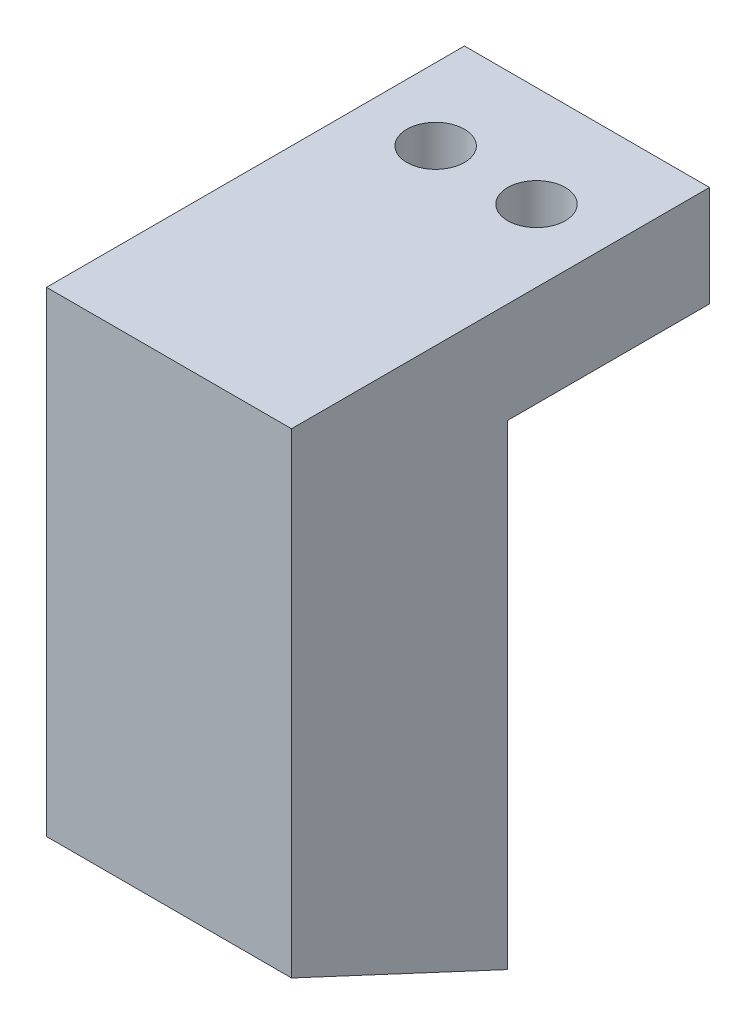
ISO-10303-21;
HEADER;
FILE_DESCRIPTION(('STEP AP214'),'2;1');
FILE_NAME('part.step','',(''),(''),'','','');
FILE_SCHEMA(('AUTOMOTIVE_DESIGN { 1 0 10303 214 1 1 1 1 }'));
ENDSEC;
DATA;
#1=APPLICATION_CONTEXT('core data for automotive mechanical design processes');
#2=APPLICATION_PROTOCOL_DEFINITION('international standard','automotive_design',2000,#1);
#3=PRODUCT_CONTEXT('',#1,'mechanical');
#4=PRODUCT('Part','Part','',(#3));
#5=PRODUCT_RELATED_PRODUCT_CATEGORY('part','',(#4));
#6=PRODUCT_DEFINITION_FORMATION('','',#4);
#7=PRODUCT_DEFINITION_CONTEXT('part definition',#1,'design');
#8=PRODUCT_DEFINITION('design','',#6,#7);
#9=PRODUCT_DEFINITION_SHAPE('','',#8);
#10=(LENGTH_UNIT() NAMED_UNIT(*) SI_UNIT(.MILLI.,.METRE.));
#11=(NAMED_UNIT(*) PLANE_ANGLE_UNIT() SI_UNIT($,.RADIAN.));
#12=(NAMED_UNIT(*) SI_UNIT($,.STERADIAN.) SOLID_ANGLE_UNIT());
#13=UNCERTAINTY_MEASURE_WITH_UNIT(LENGTH_MEASURE(1.E-05),#10,'distance_accuracy_value','');
#14=(GEOMETRIC_REPRESENTATION_CONTEXT(3) GLOBAL_UNCERTAINTY_ASSIGNED_CONTEXT((#13)) GLOBAL_UNIT_ASSIGNED_CONTEXT((#10,
#11,#12)) REPRESENTATION_CONTEXT('',''));
#15=CARTESIAN_POINT('',(0.,0.,0.));
#16=DIRECTION('',(0.,0.,1.));
#17=DIRECTION('',(1.,0.,0.));
#18=AXIS2_PLACEMENT_3D('',#15,#16,#17);
#19=CARTESIAN_POINT('',(-76.9047619047619,40.,-16.0714285714286));
#20=DIRECTION('',(0.,0.,1.));
#21=DIRECTION('',(1.,0.,0.));
#22=AXIS2_PLACEMENT_3D('',#19,#20,#21);
#23=PLANE('',#22);
#24=CARTESIAN_POINT('',(-68.3693266649987,21.4157068063248,-16.0714285714286));
#25=DIRECTION('',(0.,0.,1.));
#26=DIRECTION('',(0.,-1.,0.));
#27=AXIS2_PLACEMENT_3D('',#24,#25,#26);
#28=ELLIPSE('',#27,3.54930237472879,1.5);
#29=CARTESIAN_POINT('',(-68.3693266649987,17.866404431596,-16.0714285714286));
#30=VERTEX_POINT('',#29);
#31=EDGE_CURVE('E130',#30,#30,#28,.T.);
#32=ORIENTED_EDGE('',*,*,#31,.T.);
#33=EDGE_LOOP('',(#32));
#34=FACE_BOUND('',#33,.T.);
#35=DIRECTION('',(-1.,0.,0.));
#36=VECTOR('',#35,1.);
#37=CARTESIAN_POINT('',(-76.9047619047619,33.,-16.0714285714286));
#38=LINE('',#37,#36);
#39=CARTESIAN_POINT('',(-59.9047619047619,33.,-16.0714285714286));
#40=VERTEX_POINT('',#39);
#41=CARTESIAN_POINT('',(-76.9047619047619,33.,-16.0714285714286));
#42=VERTEX_POINT('',#41);
#43=EDGE_CURVE('E50',#40,#42,#38,.T.);
#44=ORIENTED_EDGE('',*,*,#43,.F.);
#45=DIRECTION('',(0.,-1.,0.));
#46=VECTOR('',#45,1.);
#47=CARTESIAN_POINT('',(-59.9047619047619,40.,-16.0714285714286));
#48=LINE('',#47,#46);
#49=CARTESIAN_POINT('',(-59.9047619047619,0.,-16.0714285714286));
#50=VERTEX_POINT('',#49);
#51=EDGE_CURVE('E143',#40,#50,#48,.T.);
#52=ORIENTED_EDGE('',*,*,#51,.T.);
#53=DIRECTION('',(-1.,0.,0.));
#54=VECTOR('',#53,1.);
#55=CARTESIAN_POINT('',(-76.9047619047619,0.,-16.0714285714286));
#56=LINE('',#55,#54);
#57=CARTESIAN_POINT('',(-76.9047619047619,0.,-16.0714285714286));
#58=VERTEX_POINT('',#57);
#59=EDGE_CURVE('E99',#50,#58,#56,.T.);
#60=ORIENTED_EDGE('',*,*,#59,.T.);
#61=DIRECTION('',(0.,-1.,0.));
#62=VECTOR('',#61,1.);
#63=CARTESIAN_POINT('',(-76.9047619047619,40.,-16.0714285714286));
#64=LINE('',#63,#62);
#65=EDGE_CURVE('E69',#42,#58,#64,.T.);
#66=ORIENTED_EDGE('',*,*,#65,.F.);
#67=EDGE_LOOP('',(#44,#52,#60,#66));
#68=FACE_BOUND('',#67,.T.);
#69=ADVANCED_FACE('F35',(#34,#68),#23,.F.);
#70=CARTESIAN_POINT('',(-76.9047619047619,40.,-16.0714285714286));
#71=DIRECTION('',(1.,0.,0.));
#72=DIRECTION('',(0.,0.,-1.));
#73=AXIS2_PLACEMENT_3D('',#70,#71,#72);
#74=PLANE('',#73);
#75=DIRECTION('',(0.,0.,1.));
#76=VECTOR('',#75,1.);
#77=CARTESIAN_POINT('',(-76.9047619047619,40.,-16.0714285714286));
#78=LINE('',#77,#76);
#79=CARTESIAN_POINT('',(-76.9047619047619,40.,-30.0714285714286));
#80=VERTEX_POINT('',#79);
#81=CARTESIAN_POINT('',(-76.9047619047619,40.,-1.07142857142857));
#82=VERTEX_POINT('',#81);
#83=EDGE_CURVE('E95',#80,#82,#78,.T.);
#84=ORIENTED_EDGE('',*,*,#83,.F.);
#85=DIRECTION('',(0.,1.,0.));
#86=VECTOR('',#85,1.);
#87=CARTESIAN_POINT('',(-76.9047619047619,40.,-30.0714285714286));
#88=LINE('',#87,#86);
#89=CARTESIAN_POINT('',(-76.9047619047619,33.,-30.0714285714286));
#90=VERTEX_POINT('',#89);
#91=EDGE_CURVE('E98',#90,#80,#88,.T.);
#92=ORIENTED_EDGE('',*,*,#91,.F.);
#93=DIRECTION('',(0.,0.,1.));
#94=VECTOR('',#93,1.);
#95=CARTESIAN_POINT('',(-76.9047619047619,33.,-30.0714285714286));
#96=LINE('',#95,#94);
#97=EDGE_CURVE('E121',#90,#42,#96,.T.);
#98=ORIENTED_EDGE('',*,*,#97,.T.);
#99=ORIENTED_EDGE('',*,*,#65,.T.);
#100=DIRECTION('',(0.,0.422618261740694,0.906307787036653));
#101=VECTOR('',#100,1.);
#102=CARTESIAN_POINT('',(-76.9047619047619,7.14424780626902,-0.750539709049178));
#103=LINE('',#102,#101);
#104=CARTESIAN_POINT('',(-76.9047619047619,6.99461487232486,-1.07142857142857));
#105=VERTEX_POINT('',#104);
#106=EDGE_CURVE('E136',#58,#105,#103,.T.);
#107=ORIENTED_EDGE('',*,*,#106,.T.);
#108=DIRECTION('',(0.,-1.,0.));
#109=VECTOR('',#108,1.);
#110=CARTESIAN_POINT('',(-76.9047619047619,40.,-1.07142857142857));
#111=LINE('',#110,#109);
#112=EDGE_CURVE('E11',#82,#105,#111,.T.);
#113=ORIENTED_EDGE('',*,*,#112,.F.);
#114=EDGE_LOOP('',(#84,#92,#98,#99,#107,#113));
#115=FACE_BOUND('',#114,.T.);
#116=ADVANCED_FACE('F37',(#115),#74,.F.);
#117=CARTESIAN_POINT('',(-76.9047619047619,40.,-1.07142857142857));
#118=DIRECTION('',(0.,0.,-1.));
#119=DIRECTION('',(-1.,0.,0.));
#120=AXIS2_PLACEMENT_3D('',#117,#118,#119);
#121=PLANE('',#120);
#122=ORIENTED_EDGE('',*,*,#112,.T.);
#123=DIRECTION('',(1.,0.,0.));
#124=VECTOR('',#123,1.);
#125=CARTESIAN_POINT('',(-99.9047619047619,6.99461487232486,-1.07142857142857));
#126=LINE('',#125,#124);
#127=CARTESIAN_POINT('',(-59.9047619047619,6.99461487232486,-1.07142857142857));
#128=VERTEX_POINT('',#127);
#129=EDGE_CURVE('E76',#105,#128,#126,.T.);
#130=ORIENTED_EDGE('',*,*,#129,.T.);
#131=DIRECTION('',(0.,-1.,0.));
#132=VECTOR('',#131,1.);
#133=CARTESIAN_POINT('',(-59.9047619047619,40.,-1.07142857142857));
#134=LINE('',#133,#132);
#135=CARTESIAN_POINT('',(-59.9047619047619,40.,-1.07142857142857));
#136=VERTEX_POINT('',#135);
#137=EDGE_CURVE('E43',#136,#128,#134,.T.);
#138=ORIENTED_EDGE('',*,*,#137,.F.);
#139=DIRECTION('',(1.,0.,0.));
#140=VECTOR('',#139,1.);
#141=CARTESIAN_POINT('',(-76.9047619047619,40.,-1.07142857142857));
#142=LINE('',#141,#140);
#143=EDGE_CURVE('E59',#82,#136,#142,.T.);
#144=ORIENTED_EDGE('',*,*,#143,.F.);
#145=EDGE_LOOP('',(#122,#130,#138,#144));
#146=FACE_BOUND('',#145,.T.);
#147=ADVANCED_FACE('F149',(#146),#121,.F.);
#148=CARTESIAN_POINT('',(-59.9047619047619,40.,-16.0714285714286));
#149=DIRECTION('',(-1.,0.,0.));
#150=DIRECTION('',(0.,0.,1.));
#151=AXIS2_PLACEMENT_3D('',#148,#149,#150);
#152=PLANE('',#151);
#153=ORIENTED_EDGE('',*,*,#137,.T.);
#154=DIRECTION('',(0.,0.422618261740694,0.906307787036653));
#155=VECTOR('',#154,1.);
#156=CARTESIAN_POINT('',(-59.9047619047619,6.99461487232486,-1.07142857142857));
#157=LINE('',#156,#155);
#158=EDGE_CURVE('E133',#50,#128,#157,.T.);
#159=ORIENTED_EDGE('',*,*,#158,.F.);
#160=ORIENTED_EDGE('',*,*,#51,.F.);
#161=DIRECTION('',(0.,0.,1.));
#162=VECTOR('',#161,1.);
#163=CARTESIAN_POINT('',(-59.9047619047619,33.,-30.0714285714286));
#164=LINE('',#163,#162);
#165=CARTESIAN_POINT('',(-59.9047619047619,33.,-30.0714285714286));
#166=VERTEX_POINT('',#165);
#167=EDGE_CURVE('E124',#166,#40,#164,.T.);
#168=ORIENTED_EDGE('',*,*,#167,.F.);
#169=DIRECTION('',(0.,-1.,0.));
#170=VECTOR('',#169,1.);
#171=CARTESIAN_POINT('',(-59.9047619047619,40.,-30.0714285714286));
#172=LINE('',#171,#170);
#173=CARTESIAN_POINT('',(-59.9047619047619,40.,-30.0714285714286));
#174=VERTEX_POINT('',#173);
#175=EDGE_CURVE('E108',#174,#166,#172,.T.);
#176=ORIENTED_EDGE('',*,*,#175,.F.);
#177=DIRECTION('',(0.,0.,-1.));
#178=VECTOR('',#177,1.);
#179=CARTESIAN_POINT('',(-59.9047619047619,40.,-16.0714285714286));
#180=LINE('',#179,#178);
#181=EDGE_CURVE('E105',#136,#174,#180,.T.);
#182=ORIENTED_EDGE('',*,*,#181,.F.);
#183=EDGE_LOOP('',(#153,#159,#160,#168,#176,#182));
#184=FACE_BOUND('',#183,.T.);
#185=ADVANCED_FACE('F147',(#184),#152,.F.);
#186=CARTESIAN_POINT('',(0.,40.,0.));
#187=DIRECTION('',(0.,1.,0.));
#188=DIRECTION('',(0.,0.,1.));
#189=AXIS2_PLACEMENT_3D('',#186,#187,#188);
#190=PLANE('',#189);
#191=CARTESIAN_POINT('',(-71.9047619047619,40.,-23.0714285714286));
#192=DIRECTION('',(0.,1.,0.));
#193=DIRECTION('',(0.,0.,1.));
#194=AXIS2_PLACEMENT_3D('',#191,#192,#193);
#195=CIRCLE('',#194,2.);
#196=CARTESIAN_POINT('',(-71.9047619047619,40.,-21.0714285714286));
#197=VERTEX_POINT('',#196);
#198=EDGE_CURVE('E115',#197,#197,#195,.T.);
#199=ORIENTED_EDGE('',*,*,#198,.F.);
#200=EDGE_LOOP('',(#199));
#201=FACE_BOUND('',#200,.T.);
#202=CARTESIAN_POINT('',(-64.9047619047619,40.,-23.0714285714286));
#203=DIRECTION('',(0.,1.,0.));
#204=DIRECTION('',(0.,0.,1.));
#205=AXIS2_PLACEMENT_3D('',#202,#203,#204);
#206=CIRCLE('',#205,2.);
#207=CARTESIAN_POINT('',(-64.9047619047619,40.,-21.0714285714286));
#208=VERTEX_POINT('',#207);
#209=EDGE_CURVE('E197',#208,#208,#206,.T.);
#210=ORIENTED_EDGE('',*,*,#209,.F.);
#211=EDGE_LOOP('',(#210));
#212=FACE_BOUND('',#211,.T.);
#213=ORIENTED_EDGE('',*,*,#83,.T.);
#214=ORIENTED_EDGE('',*,*,#143,.T.);
#215=ORIENTED_EDGE('',*,*,#181,.T.);
#216=DIRECTION('',(1.,0.,0.));
#217=VECTOR('',#216,1.);
#218=CARTESIAN_POINT('',(-76.9047619047619,40.,-30.0714285714286));
#219=LINE('',#218,#217);
#220=EDGE_CURVE('E102',#80,#174,#219,.T.);
#221=ORIENTED_EDGE('',*,*,#220,.F.);
#222=EDGE_LOOP('',(#213,#214,#215,#221));
#223=FACE_BOUND('',#222,.T.);
#224=ADVANCED_FACE('F103',(#201,#212,#223),#190,.T.);
#225=CARTESIAN_POINT('',(-99.9047619047619,6.99461487232486,-1.07142857142857));
#226=DIRECTION('',(0.,0.906307787036653,-0.422618261740694));
#227=DIRECTION('',(0.,0.422618261740694,0.906307787036653));
#228=AXIS2_PLACEMENT_3D('',#225,#226,#227);
#229=PLANE('',#228);
#230=CARTESIAN_POINT('',(-68.3693266649987,3.82497790926966,-7.86873697420347));
#231=DIRECTION('',(0.,-0.906307787036653,0.422618261740693));
#232=DIRECTION('',(0.,-0.422618261740693,-0.906307787036653));
#233=AXIS2_PLACEMENT_3D('',#230,#231,#232);
#234=CIRCLE('',#233,1.5);
#235=CARTESIAN_POINT('',(-68.3693266649987,3.19105051665862,-9.22819865475844));
#236=VERTEX_POINT('',#235);
#237=EDGE_CURVE('E127',#236,#236,#234,.T.);
#238=ORIENTED_EDGE('',*,*,#237,.F.);
#239=EDGE_LOOP('',(#238));
#240=FACE_BOUND('',#239,.T.);
#241=ORIENTED_EDGE('',*,*,#59,.F.);
#242=ORIENTED_EDGE('',*,*,#158,.T.);
#243=ORIENTED_EDGE('',*,*,#129,.F.);
#244=ORIENTED_EDGE('',*,*,#106,.F.);
#245=EDGE_LOOP('',(#241,#242,#243,#244));
#246=FACE_BOUND('',#245,.T.);
#247=ADVANCED_FACE('F167',(#240,#246),#229,.F.);
#248=CARTESIAN_POINT('',(-68.3693266649987,36.4520582425892,-23.0829943968684));
#249=DIRECTION('',(0.,-0.906307787036653,0.422618261740693));
#250=DIRECTION('',(0.,-0.422618261740693,-0.906307787036653));
#251=AXIS2_PLACEMENT_3D('',#248,#249,#250);
#252=CYLINDRICAL_SURFACE('',#251,1.5);
#253=ORIENTED_EDGE('',*,*,#237,.T.);
#254=EDGE_LOOP('',(#253));
#255=FACE_BOUND('',#254,.T.);
#256=ORIENTED_EDGE('',*,*,#31,.F.);
#257=EDGE_LOOP('',(#256));
#258=FACE_BOUND('',#257,.T.);
#259=ADVANCED_FACE('F171',(#255,#258),#252,.F.);
#260=CARTESIAN_POINT('',(-76.9047619047619,33.,-30.0714285714286));
#261=DIRECTION('',(0.,1.,0.));
#262=DIRECTION('',(0.,0.,1.));
#263=AXIS2_PLACEMENT_3D('',#260,#261,#262);
#264=PLANE('',#263);
#265=CARTESIAN_POINT('',(-71.9047619047619,33.,-23.0714285714286));
#266=DIRECTION('',(0.,-1.,0.));
#267=DIRECTION('',(0.,0.,-1.));
#268=AXIS2_PLACEMENT_3D('',#265,#266,#267);
#269=CIRCLE('',#268,2.);
#270=CARTESIAN_POINT('',(-71.9047619047619,33.,-25.0714285714286));
#271=VERTEX_POINT('',#270);
#272=EDGE_CURVE('E196',#271,#271,#269,.T.);
#273=ORIENTED_EDGE('',*,*,#272,.F.);
#274=EDGE_LOOP('',(#273));
#275=FACE_BOUND('',#274,.T.);
#276=CARTESIAN_POINT('',(-64.9047619047619,33.,-23.0714285714286));
#277=DIRECTION('',(0.,-1.,0.));
#278=DIRECTION('',(0.,0.,-1.));
#279=AXIS2_PLACEMENT_3D('',#276,#277,#278);
#280=CIRCLE('',#279,2.);
#281=CARTESIAN_POINT('',(-64.9047619047619,33.,-25.0714285714286));
#282=VERTEX_POINT('',#281);
#283=EDGE_CURVE('E198',#282,#282,#280,.T.);
#284=ORIENTED_EDGE('',*,*,#283,.F.);
#285=EDGE_LOOP('',(#284));
#286=FACE_BOUND('',#285,.T.);
#287=ORIENTED_EDGE('',*,*,#43,.T.);
#288=ORIENTED_EDGE('',*,*,#97,.F.);
#289=DIRECTION('',(-1.,0.,0.));
#290=VECTOR('',#289,1.);
#291=CARTESIAN_POINT('',(-76.9047619047619,33.,-30.0714285714286));
#292=LINE('',#291,#290);
#293=EDGE_CURVE('E112',#166,#90,#292,.T.);
#294=ORIENTED_EDGE('',*,*,#293,.F.);
#295=ORIENTED_EDGE('',*,*,#167,.T.);
#296=EDGE_LOOP('',(#287,#288,#294,#295));
#297=FACE_BOUND('',#296,.T.);
#298=ADVANCED_FACE('F175',(#275,#286,#297),#264,.F.);
#299=CARTESIAN_POINT('',(0.,0.,-30.0714285714286));
#300=DIRECTION('',(0.,0.,1.));
#301=DIRECTION('',(1.,0.,0.));
#302=AXIS2_PLACEMENT_3D('',#299,#300,#301);
#303=PLANE('',#302);
#304=ORIENTED_EDGE('',*,*,#91,.T.);
#305=ORIENTED_EDGE('',*,*,#220,.T.);
#306=ORIENTED_EDGE('',*,*,#175,.T.);
#307=ORIENTED_EDGE('',*,*,#293,.T.);
#308=EDGE_LOOP('',(#304,#305,#306,#307));
#309=FACE_BOUND('',#308,.T.);
#310=ADVANCED_FACE('F110',(#309),#303,.F.);
#311=CARTESIAN_POINT('',(-64.9047619047619,47.,-23.0714285714286));
#312=DIRECTION('',(0.,-1.,0.));
#313=DIRECTION('',(0.,0.,-1.));
#314=AXIS2_PLACEMENT_3D('',#311,#312,#313);
#315=CYLINDRICAL_SURFACE('',#314,2.);
#316=ORIENTED_EDGE('',*,*,#209,.T.);
#317=EDGE_LOOP('',(#316));
#318=FACE_BOUND('',#317,.T.);
#319=ORIENTED_EDGE('',*,*,#283,.T.);
#320=EDGE_LOOP('',(#319));
#321=FACE_BOUND('',#320,.T.);
#322=ADVANCED_FACE('F182',(#318,#321),#315,.F.);
#323=CARTESIAN_POINT('',(-71.9047619047619,47.,-23.0714285714286));
#324=DIRECTION('',(0.,-1.,0.));
#325=DIRECTION('',(0.,0.,-1.));
#326=AXIS2_PLACEMENT_3D('',#323,#324,#325);
#327=CYLINDRICAL_SURFACE('',#326,2.);
#328=ORIENTED_EDGE('',*,*,#198,.T.);
#329=EDGE_LOOP('',(#328));
#330=FACE_BOUND('',#329,.T.);
#331=ORIENTED_EDGE('',*,*,#272,.T.);
#332=EDGE_LOOP('',(#331));
#333=FACE_BOUND('',#332,.T.);
#334=ADVANCED_FACE('F185',(#330,#333),#327,.F.);
#335=CLOSED_SHELL('',(#69,#116,#147,#185,#224,#247,#259,#298,#310,#322,#334));
#336=MANIFOLD_SOLID_BREP('B2',#335);
#337=ADVANCED_BREP_SHAPE_REPRESENTATION('',(#18,#336),#14);
#338=SHAPE_DEFINITION_REPRESENTATION(#9,#337);
ENDSEC;
END-ISO-10303-21;
